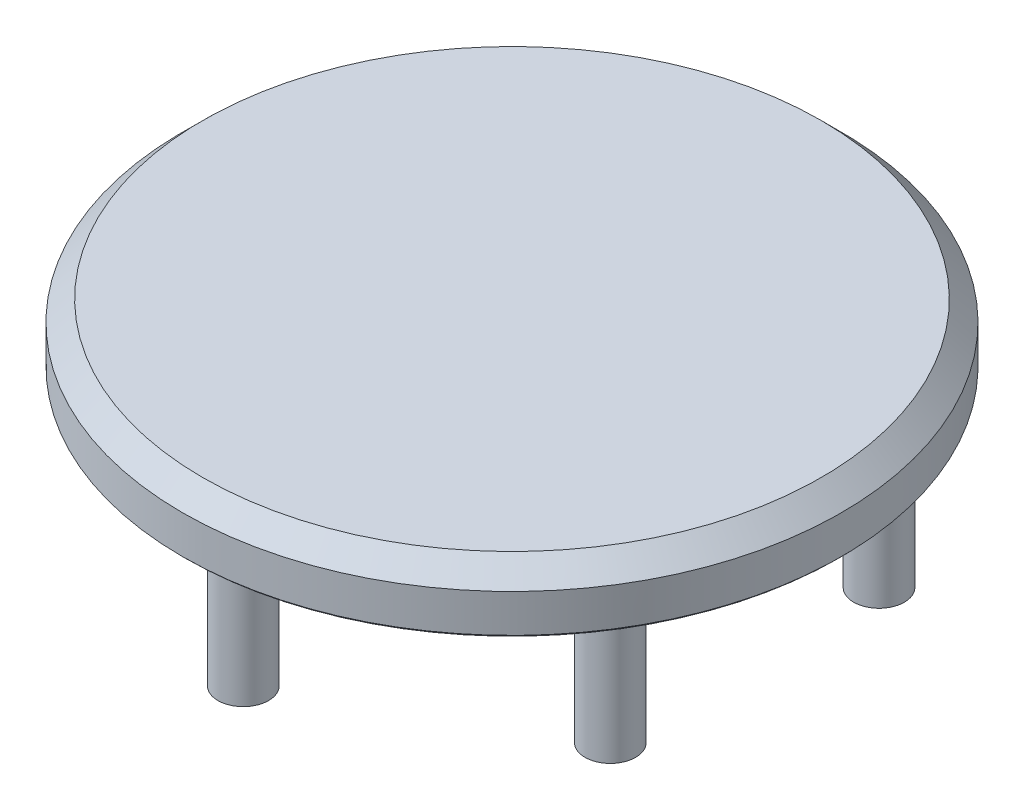
ISO-10303-21;
HEADER;
FILE_DESCRIPTION(('STEP AP214'),'2;1');
FILE_NAME('part.step','',(''),(''),'','','');
FILE_SCHEMA(('AUTOMOTIVE_DESIGN { 1 0 10303 214 1 1 1 1 }'));
ENDSEC;
DATA;
#1=APPLICATION_CONTEXT('core data for automotive mechanical design processes');
#2=APPLICATION_PROTOCOL_DEFINITION('international standard','automotive_design',2000,#1);
#3=PRODUCT_CONTEXT('',#1,'mechanical');
#4=PRODUCT('Part','Part','',(#3));
#5=PRODUCT_RELATED_PRODUCT_CATEGORY('part','',(#4));
#6=PRODUCT_DEFINITION_FORMATION('','',#4);
#7=PRODUCT_DEFINITION_CONTEXT('part definition',#1,'design');
#8=PRODUCT_DEFINITION('design','',#6,#7);
#9=PRODUCT_DEFINITION_SHAPE('','',#8);
#10=(LENGTH_UNIT() NAMED_UNIT(*) SI_UNIT(.MILLI.,.METRE.));
#11=(NAMED_UNIT(*) PLANE_ANGLE_UNIT() SI_UNIT($,.RADIAN.));
#12=(NAMED_UNIT(*) SI_UNIT($,.STERADIAN.) SOLID_ANGLE_UNIT());
#13=UNCERTAINTY_MEASURE_WITH_UNIT(LENGTH_MEASURE(1.E-05),#10,'distance_accuracy_value','');
#14=(GEOMETRIC_REPRESENTATION_CONTEXT(3) GLOBAL_UNCERTAINTY_ASSIGNED_CONTEXT((#13)) GLOBAL_UNIT_ASSIGNED_CONTEXT((#10,
#11,#12)) REPRESENTATION_CONTEXT('',''));
#15=CARTESIAN_POINT('',(0.,0.,0.));
#16=DIRECTION('',(0.,0.,1.));
#17=DIRECTION('',(1.,0.,0.));
#18=AXIS2_PLACEMENT_3D('',#15,#16,#17);
#19=CARTESIAN_POINT('',(0.,25.,0.));
#20=DIRECTION('',(0.,-1.,0.));
#21=DIRECTION('',(0.,0.,-1.));
#22=AXIS2_PLACEMENT_3D('',#19,#20,#21);
#23=PLANE('',#22);
#24=CARTESIAN_POINT('',(0.,25.,0.));
#25=DIRECTION('',(0.,-1.,0.));
#26=DIRECTION('',(0.,0.,-1.));
#27=AXIS2_PLACEMENT_3D('',#24,#25,#26);
#28=CIRCLE('',#27,32.25);
#29=CARTESIAN_POINT('',(0.,25.,-32.25));
#30=VERTEX_POINT('',#29);
#31=EDGE_CURVE('E10',#30,#30,#28,.T.);
#32=ORIENTED_EDGE('',*,*,#31,.T.);
#33=EDGE_LOOP('',(#32));
#34=FACE_BOUND('',#33,.T.);
#35=CARTESIAN_POINT('',(0.,25.,26.5));
#36=DIRECTION('',(0.,-1.,0.));
#37=DIRECTION('',(0.,0.,-1.));
#38=AXIS2_PLACEMENT_3D('',#35,#36,#37);
#39=CIRCLE('',#38,4.50000000000001);
#40=CARTESIAN_POINT('',(0.,25.,22.));
#41=VERTEX_POINT('',#40);
#42=EDGE_CURVE('E62',#41,#41,#39,.F.);
#43=ORIENTED_EDGE('',*,*,#42,.T.);
#44=EDGE_LOOP('',(#43));
#45=FACE_BOUND('',#44,.T.);
#46=CARTESIAN_POINT('',(-22.9496732002875,25.,13.2500000000003));
#47=DIRECTION('',(0.,-1.,0.));
#48=DIRECTION('',(0.,0.,-1.));
#49=AXIS2_PLACEMENT_3D('',#46,#47,#48);
#50=CIRCLE('',#49,4.49999999999999);
#51=CARTESIAN_POINT('',(-22.9496732002875,25.,8.75000000000028));
#52=VERTEX_POINT('',#51);
#53=EDGE_CURVE('E65',#52,#52,#50,.F.);
#54=ORIENTED_EDGE('',*,*,#53,.T.);
#55=EDGE_LOOP('',(#54));
#56=FACE_BOUND('',#55,.T.);
#57=CARTESIAN_POINT('',(-22.9496732002877,25.,-13.2499999999998));
#58=DIRECTION('',(0.,-1.,0.));
#59=DIRECTION('',(0.,0.,-1.));
#60=AXIS2_PLACEMENT_3D('',#57,#58,#59);
#61=CIRCLE('',#60,4.5);
#62=CARTESIAN_POINT('',(-22.9496732002877,25.,-17.7499999999998));
#63=VERTEX_POINT('',#62);
#64=EDGE_CURVE('E68',#63,#63,#61,.F.);
#65=ORIENTED_EDGE('',*,*,#64,.T.);
#66=EDGE_LOOP('',(#65));
#67=FACE_BOUND('',#66,.T.);
#68=CARTESIAN_POINT('',(0.,25.,-26.5));
#69=DIRECTION('',(0.,-1.,0.));
#70=DIRECTION('',(0.,0.,-1.));
#71=AXIS2_PLACEMENT_3D('',#68,#69,#70);
#72=CIRCLE('',#71,4.50000000000001);
#73=CARTESIAN_POINT('',(0.,25.,-31.));
#74=VERTEX_POINT('',#73);
#75=EDGE_CURVE('E71',#74,#74,#72,.F.);
#76=ORIENTED_EDGE('',*,*,#75,.T.);
#77=EDGE_LOOP('',(#76));
#78=FACE_BOUND('',#77,.T.);
#79=CARTESIAN_POINT('',(22.9496732002876,25.,-13.2500000000001));
#80=DIRECTION('',(0.,-1.,0.));
#81=DIRECTION('',(0.,0.,-1.));
#82=AXIS2_PLACEMENT_3D('',#79,#80,#81);
#83=CIRCLE('',#82,4.49999999999999);
#84=CARTESIAN_POINT('',(22.9496732002876,25.,-17.7500000000001));
#85=VERTEX_POINT('',#84);
#86=EDGE_CURVE('E74',#85,#85,#83,.F.);
#87=ORIENTED_EDGE('',*,*,#86,.T.);
#88=EDGE_LOOP('',(#87));
#89=FACE_BOUND('',#88,.T.);
#90=CARTESIAN_POINT('',(22.9496732002877,25.,13.2499999999999));
#91=DIRECTION('',(0.,-1.,0.));
#92=DIRECTION('',(0.,0.,-1.));
#93=AXIS2_PLACEMENT_3D('',#90,#91,#92);
#94=CIRCLE('',#93,4.49999999999997);
#95=CARTESIAN_POINT('',(22.9496732002877,25.,8.74999999999998));
#96=VERTEX_POINT('',#95);
#97=EDGE_CURVE('E77',#96,#96,#94,.F.);
#98=ORIENTED_EDGE('',*,*,#97,.T.);
#99=EDGE_LOOP('',(#98));
#100=FACE_BOUND('',#99,.T.);
#101=ADVANCED_FACE('F33',(#34,#45,#56,#67,#78,#89,#100),#23,.T.);
#102=CARTESIAN_POINT('',(0.,0.,0.));
#103=DIRECTION('',(0.,1.,0.));
#104=DIRECTION('',(0.,0.,1.));
#105=AXIS2_PLACEMENT_3D('',#102,#103,#104);
#106=CYLINDRICAL_SURFACE('',#105,32.5);
#107=CARTESIAN_POINT('',(0.,25.25,0.));
#108=DIRECTION('',(0.,-1.,0.));
#109=DIRECTION('',(0.,0.,-1.));
#110=AXIS2_PLACEMENT_3D('',#107,#108,#109);
#111=CIRCLE('',#110,32.5);
#112=CARTESIAN_POINT('',(0.,25.25,-32.5));
#113=VERTEX_POINT('',#112);
#114=EDGE_CURVE('E40',#113,#113,#111,.F.);
#115=ORIENTED_EDGE('',*,*,#114,.T.);
#116=EDGE_LOOP('',(#115));
#117=FACE_BOUND('',#116,.T.);
#118=CARTESIAN_POINT('',(0.,29.,0.));
#119=DIRECTION('',(0.,1.,0.));
#120=DIRECTION('',(0.,0.,1.));
#121=AXIS2_PLACEMENT_3D('',#118,#119,#120);
#122=CIRCLE('',#121,32.5);
#123=CARTESIAN_POINT('',(0.,29.,32.5));
#124=VERTEX_POINT('',#123);
#125=EDGE_CURVE('E83',#124,#124,#122,.F.);
#126=ORIENTED_EDGE('',*,*,#125,.T.);
#127=EDGE_LOOP('',(#126));
#128=FACE_BOUND('',#127,.T.);
#129=ADVANCED_FACE('F125',(#117,#128),#106,.T.);
#130=CARTESIAN_POINT('',(0.,31.,32.5));
#131=DIRECTION('',(0.,1.,0.));
#132=DIRECTION('',(0.,0.,1.));
#133=AXIS2_PLACEMENT_3D('',#130,#131,#132);
#134=PLANE('',#133);
#135=CARTESIAN_POINT('',(0.,31.,0.));
#136=DIRECTION('',(0.,1.,0.));
#137=DIRECTION('',(0.,0.,1.));
#138=AXIS2_PLACEMENT_3D('',#135,#136,#137);
#139=CIRCLE('',#138,30.5);
#140=CARTESIAN_POINT('',(0.,31.,30.5));
#141=VERTEX_POINT('',#140);
#142=EDGE_CURVE('E86',#141,#141,#139,.T.);
#143=ORIENTED_EDGE('',*,*,#142,.T.);
#144=EDGE_LOOP('',(#143));
#145=FACE_BOUND('',#144,.T.);
#146=ADVANCED_FACE('F130',(#145),#134,.T.);
#147=CARTESIAN_POINT('',(0.,31.,0.));
#148=DIRECTION('',(0.,-1.,0.));
#149=DIRECTION('',(0.,0.,-1.));
#150=AXIS2_PLACEMENT_3D('',#147,#148,#149);
#151=CONICAL_SURFACE('',#150,30.5,0.785398163397445);
#152=ORIENTED_EDGE('',*,*,#125,.F.);
#153=EDGE_LOOP('',(#152));
#154=FACE_BOUND('',#153,.T.);
#155=ORIENTED_EDGE('',*,*,#142,.F.);
#156=EDGE_LOOP('',(#155));
#157=FACE_BOUND('',#156,.T.);
#158=ADVANCED_FACE('F135',(#154,#157),#151,.T.);
#159=CARTESIAN_POINT('',(0.,4.12893218813453,26.5));
#160=DIRECTION('',(0.,1.,0.));
#161=DIRECTION('',(0.,0.,1.));
#162=AXIS2_PLACEMENT_3D('',#159,#160,#161);
#163=CYLINDRICAL_SURFACE('',#162,2.5);
#164=CARTESIAN_POINT('',(0.,23.,26.5));
#165=DIRECTION('',(0.,-1.,0.));
#166=DIRECTION('',(0.,0.,-1.));
#167=AXIS2_PLACEMENT_3D('',#164,#165,#166);
#168=CIRCLE('',#167,2.5);
#169=CARTESIAN_POINT('',(0.,23.,24.));
#170=VERTEX_POINT('',#169);
#171=EDGE_CURVE('E80',#170,#170,#168,.T.);
#172=ORIENTED_EDGE('',*,*,#171,.T.);
#173=EDGE_LOOP('',(#172));
#174=FACE_BOUND('',#173,.T.);
#175=CARTESIAN_POINT('',(0.,11.2,26.5));
#176=DIRECTION('',(0.,1.,0.));
#177=DIRECTION('',(0.,0.,1.));
#178=AXIS2_PLACEMENT_3D('',#175,#176,#177);
#179=CIRCLE('',#178,2.5);
#180=CARTESIAN_POINT('',(0.,11.2,29.));
#181=VERTEX_POINT('',#180);
#182=EDGE_CURVE('E89',#181,#181,#179,.T.);
#183=ORIENTED_EDGE('',*,*,#182,.T.);
#184=EDGE_LOOP('',(#183));
#185=FACE_BOUND('',#184,.T.);
#186=ADVANCED_FACE('F137',(#174,#185),#163,.T.);
#187=CARTESIAN_POINT('',(-32.,11.2,0.));
#188=DIRECTION('',(0.,1.,0.));
#189=DIRECTION('',(0.,0.,1.));
#190=AXIS2_PLACEMENT_3D('',#187,#188,#189);
#191=PLANE('',#190);
#192=ORIENTED_EDGE('',*,*,#182,.F.);
#193=EDGE_LOOP('',(#192));
#194=FACE_BOUND('',#193,.T.);
#195=ADVANCED_FACE('F169',(#194),#191,.F.);
#196=CARTESIAN_POINT('',(22.9496732002877,4.12893218813453,13.2499999999999));
#197=DIRECTION('',(0.,1.,0.));
#198=DIRECTION('',(0.86602540378444,0.,0.499999999999998));
#199=AXIS2_PLACEMENT_3D('',#196,#197,#198);
#200=CYLINDRICAL_SURFACE('',#199,2.5);
#201=CARTESIAN_POINT('',(22.9496732002877,23.,13.2499999999999));
#202=DIRECTION('',(0.,-1.,0.));
#203=DIRECTION('',(0.,0.,-1.));
#204=AXIS2_PLACEMENT_3D('',#201,#202,#203);
#205=CIRCLE('',#204,2.5);
#206=CARTESIAN_POINT('',(22.9496732002877,23.,10.7499999999999));
#207=VERTEX_POINT('',#206);
#208=EDGE_CURVE('E44',#207,#207,#205,.T.);
#209=ORIENTED_EDGE('',*,*,#208,.T.);
#210=EDGE_LOOP('',(#209));
#211=FACE_BOUND('',#210,.T.);
#212=CARTESIAN_POINT('',(22.9496732002877,11.2,13.2499999999999));
#213=DIRECTION('',(0.,1.,0.));
#214=DIRECTION('',(0.86602540378444,0.,0.499999999999998));
#215=AXIS2_PLACEMENT_3D('',#212,#213,#214);
#216=CIRCLE('',#215,2.5);
#217=CARTESIAN_POINT('',(25.1147367097488,11.2,14.4999999999999));
#218=VERTEX_POINT('',#217);
#219=EDGE_CURVE('E92',#218,#218,#216,.T.);
#220=ORIENTED_EDGE('',*,*,#219,.T.);
#221=EDGE_LOOP('',(#220));
#222=FACE_BOUND('',#221,.T.);
#223=ADVANCED_FACE('F165',(#211,#222),#200,.T.);
#224=CARTESIAN_POINT('',(-15.9999999999999,11.2,27.7128129211021));
#225=DIRECTION('',(0.,1.,0.));
#226=DIRECTION('',(0.86602540378444,0.,0.499999999999998));
#227=AXIS2_PLACEMENT_3D('',#224,#225,#226);
#228=PLANE('',#227);
#229=ORIENTED_EDGE('',*,*,#219,.F.);
#230=EDGE_LOOP('',(#229));
#231=FACE_BOUND('',#230,.T.);
#232=ADVANCED_FACE('F168',(#231),#228,.F.);
#233=CARTESIAN_POINT('',(22.9496732002876,4.12893218813453,-13.2500000000001));
#234=DIRECTION('',(0.,1.,0.));
#235=DIRECTION('',(0.866025403784436,0.,-0.500000000000004));
#236=AXIS2_PLACEMENT_3D('',#233,#234,#235);
#237=CYLINDRICAL_SURFACE('',#236,2.5);
#238=CARTESIAN_POINT('',(22.9496732002876,23.,-13.2500000000001));
#239=DIRECTION('',(0.,-1.,0.));
#240=DIRECTION('',(0.,0.,-1.));
#241=AXIS2_PLACEMENT_3D('',#238,#239,#240);
#242=CIRCLE('',#241,2.5);
#243=CARTESIAN_POINT('',(22.9496732002876,23.,-15.7500000000001));
#244=VERTEX_POINT('',#243);
#245=EDGE_CURVE('E48',#244,#244,#242,.T.);
#246=ORIENTED_EDGE('',*,*,#245,.T.);
#247=EDGE_LOOP('',(#246));
#248=FACE_BOUND('',#247,.T.);
#249=CARTESIAN_POINT('',(22.9496732002876,11.2,-13.2500000000001));
#250=DIRECTION('',(0.,1.,0.));
#251=DIRECTION('',(0.866025403784436,0.,-0.500000000000004));
#252=AXIS2_PLACEMENT_3D('',#249,#250,#251);
#253=CIRCLE('',#252,2.5);
#254=CARTESIAN_POINT('',(25.1147367097487,11.2,-14.5000000000001));
#255=VERTEX_POINT('',#254);
#256=EDGE_CURVE('E95',#255,#255,#253,.T.);
#257=ORIENTED_EDGE('',*,*,#256,.T.);
#258=EDGE_LOOP('',(#257));
#259=FACE_BOUND('',#258,.T.);
#260=ADVANCED_FACE('F174',(#248,#259),#237,.T.);
#261=CARTESIAN_POINT('',(16.0000000000001,11.2,27.712812921102));
#262=DIRECTION('',(0.,1.,0.));
#263=DIRECTION('',(0.866025403784436,0.,-0.500000000000004));
#264=AXIS2_PLACEMENT_3D('',#261,#262,#263);
#265=PLANE('',#264);
#266=ORIENTED_EDGE('',*,*,#256,.F.);
#267=EDGE_LOOP('',(#266));
#268=FACE_BOUND('',#267,.T.);
#269=ADVANCED_FACE('F179',(#268),#265,.F.);
#270=CARTESIAN_POINT('',(0.,4.12893218813453,-26.5));
#271=DIRECTION('',(0.,1.,0.));
#272=DIRECTION('',(0.,0.,-1.));
#273=AXIS2_PLACEMENT_3D('',#270,#271,#272);
#274=CYLINDRICAL_SURFACE('',#273,2.5);
#275=CARTESIAN_POINT('',(0.,23.,-26.5));
#276=DIRECTION('',(0.,-1.,0.));
#277=DIRECTION('',(0.,0.,-1.));
#278=AXIS2_PLACEMENT_3D('',#275,#276,#277);
#279=CIRCLE('',#278,2.5);
#280=CARTESIAN_POINT('',(0.,23.,-29.));
#281=VERTEX_POINT('',#280);
#282=EDGE_CURVE('E53',#281,#281,#279,.T.);
#283=ORIENTED_EDGE('',*,*,#282,.T.);
#284=EDGE_LOOP('',(#283));
#285=FACE_BOUND('',#284,.T.);
#286=CARTESIAN_POINT('',(0.,11.2,-26.5));
#287=DIRECTION('',(0.,1.,0.));
#288=DIRECTION('',(0.,0.,-1.));
#289=AXIS2_PLACEMENT_3D('',#286,#287,#288);
#290=CIRCLE('',#289,2.5);
#291=CARTESIAN_POINT('',(0.,11.2,-29.));
#292=VERTEX_POINT('',#291);
#293=EDGE_CURVE('E98',#292,#292,#290,.T.);
#294=ORIENTED_EDGE('',*,*,#293,.T.);
#295=EDGE_LOOP('',(#294));
#296=FACE_BOUND('',#295,.T.);
#297=ADVANCED_FACE('F227',(#285,#296),#274,.T.);
#298=CARTESIAN_POINT('',(32.,11.2,0.));
#299=DIRECTION('',(0.,1.,0.));
#300=DIRECTION('',(0.,0.,-1.));
#301=AXIS2_PLACEMENT_3D('',#298,#299,#300);
#302=PLANE('',#301);
#303=ORIENTED_EDGE('',*,*,#293,.F.);
#304=EDGE_LOOP('',(#303));
#305=FACE_BOUND('',#304,.T.);
#306=ADVANCED_FACE('F232',(#305),#302,.F.);
#307=CARTESIAN_POINT('',(-22.9496732002877,4.12893218813453,-13.2499999999998));
#308=DIRECTION('',(0.,1.,0.));
#309=DIRECTION('',(-0.866025403784443,0.,-0.499999999999992));
#310=AXIS2_PLACEMENT_3D('',#307,#308,#309);
#311=CYLINDRICAL_SURFACE('',#310,2.5);
#312=CARTESIAN_POINT('',(-22.9496732002877,23.,-13.2499999999998));
#313=DIRECTION('',(0.,-1.,0.));
#314=DIRECTION('',(0.,0.,-1.));
#315=AXIS2_PLACEMENT_3D('',#312,#313,#314);
#316=CIRCLE('',#315,2.5);
#317=CARTESIAN_POINT('',(-22.9496732002877,23.,-15.7499999999998));
#318=VERTEX_POINT('',#317);
#319=EDGE_CURVE('E56',#318,#318,#316,.T.);
#320=ORIENTED_EDGE('',*,*,#319,.T.);
#321=EDGE_LOOP('',(#320));
#322=FACE_BOUND('',#321,.T.);
#323=CARTESIAN_POINT('',(-22.9496732002877,11.2,-13.2499999999998));
#324=DIRECTION('',(0.,1.,0.));
#325=DIRECTION('',(-0.866025403784443,0.,-0.499999999999992));
#326=AXIS2_PLACEMENT_3D('',#323,#324,#325);
#327=CIRCLE('',#326,2.5);
#328=CARTESIAN_POINT('',(-25.1147367097489,11.2,-14.4999999999998));
#329=VERTEX_POINT('',#328);
#330=EDGE_CURVE('E101',#329,#329,#327,.T.);
#331=ORIENTED_EDGE('',*,*,#330,.T.);
#332=EDGE_LOOP('',(#331));
#333=FACE_BOUND('',#332,.T.);
#334=ADVANCED_FACE('F240',(#322,#333),#311,.T.);
#335=CARTESIAN_POINT('',(15.9999999999997,11.2,-27.7128129211022));
#336=DIRECTION('',(0.,1.,0.));
#337=DIRECTION('',(-0.866025403784443,0.,-0.499999999999992));
#338=AXIS2_PLACEMENT_3D('',#335,#336,#337);
#339=PLANE('',#338);
#340=ORIENTED_EDGE('',*,*,#330,.F.);
#341=EDGE_LOOP('',(#340));
#342=FACE_BOUND('',#341,.T.);
#343=ADVANCED_FACE('F121',(#342),#339,.F.);
#344=CARTESIAN_POINT('',(-22.9496732002875,4.12893218813453,13.2500000000003));
#345=DIRECTION('',(0.,1.,0.));
#346=DIRECTION('',(-0.866025403784433,0.,0.50000000000001));
#347=AXIS2_PLACEMENT_3D('',#344,#345,#346);
#348=CYLINDRICAL_SURFACE('',#347,2.5);
#349=CARTESIAN_POINT('',(-22.9496732002875,23.,13.2500000000003));
#350=DIRECTION('',(0.,-1.,0.));
#351=DIRECTION('',(0.,0.,-1.));
#352=AXIS2_PLACEMENT_3D('',#349,#350,#351);
#353=CIRCLE('',#352,2.5);
#354=CARTESIAN_POINT('',(-22.9496732002875,23.,10.7500000000003));
#355=VERTEX_POINT('',#354);
#356=EDGE_CURVE('E59',#355,#355,#353,.T.);
#357=ORIENTED_EDGE('',*,*,#356,.T.);
#358=EDGE_LOOP('',(#357));
#359=FACE_BOUND('',#358,.T.);
#360=CARTESIAN_POINT('',(-22.9496732002875,11.2,13.2500000000003));
#361=DIRECTION('',(0.,1.,0.));
#362=DIRECTION('',(-0.866025403784433,0.,0.50000000000001));
#363=AXIS2_PLACEMENT_3D('',#360,#361,#362);
#364=CIRCLE('',#363,2.5);
#365=CARTESIAN_POINT('',(-25.1147367097485,11.2,14.5000000000003));
#366=VERTEX_POINT('',#365);
#367=EDGE_CURVE('E104',#366,#366,#364,.T.);
#368=ORIENTED_EDGE('',*,*,#367,.T.);
#369=EDGE_LOOP('',(#368));
#370=FACE_BOUND('',#369,.T.);
#371=ADVANCED_FACE('F108',(#359,#370),#348,.T.);
#372=CARTESIAN_POINT('',(-16.0000000000003,11.2,-27.7128129211019));
#373=DIRECTION('',(0.,1.,0.));
#374=DIRECTION('',(-0.866025403784433,0.,0.50000000000001));
#375=AXIS2_PLACEMENT_3D('',#372,#373,#374);
#376=PLANE('',#375);
#377=ORIENTED_EDGE('',*,*,#367,.F.);
#378=EDGE_LOOP('',(#377));
#379=FACE_BOUND('',#378,.T.);
#380=ADVANCED_FACE('F110',(#379),#376,.F.);
#381=CARTESIAN_POINT('',(0.,23.,26.5));
#382=DIRECTION('',(0.,1.,0.));
#383=DIRECTION('',(0.,0.,1.));
#384=AXIS2_PLACEMENT_3D('',#381,#382,#383);
#385=CONICAL_SURFACE('',#384,2.5,0.785398163397445);
#386=ORIENTED_EDGE('',*,*,#42,.F.);
#387=EDGE_LOOP('',(#386));
#388=FACE_BOUND('',#387,.T.);
#389=ORIENTED_EDGE('',*,*,#171,.F.);
#390=EDGE_LOOP('',(#389));
#391=FACE_BOUND('',#390,.T.);
#392=ADVANCED_FACE('F112',(#388,#391),#385,.T.);
#393=CARTESIAN_POINT('',(-22.9496732002875,23.,13.2500000000003));
#394=DIRECTION('',(0.,1.,0.));
#395=DIRECTION('',(0.,0.,1.));
#396=AXIS2_PLACEMENT_3D('',#393,#394,#395);
#397=CONICAL_SURFACE('',#396,2.5,0.78539816339744);
#398=ORIENTED_EDGE('',*,*,#53,.F.);
#399=EDGE_LOOP('',(#398));
#400=FACE_BOUND('',#399,.T.);
#401=ORIENTED_EDGE('',*,*,#356,.F.);
#402=EDGE_LOOP('',(#401));
#403=FACE_BOUND('',#402,.T.);
#404=ADVANCED_FACE('F118',(#400,#403),#397,.T.);
#405=CARTESIAN_POINT('',(-22.9496732002877,23.,-13.2499999999998));
#406=DIRECTION('',(0.,1.,0.));
#407=DIRECTION('',(0.,0.,1.));
#408=AXIS2_PLACEMENT_3D('',#405,#406,#407);
#409=CONICAL_SURFACE('',#408,2.5,0.785398163397444);
#410=ORIENTED_EDGE('',*,*,#64,.F.);
#411=EDGE_LOOP('',(#410));
#412=FACE_BOUND('',#411,.T.);
#413=ORIENTED_EDGE('',*,*,#319,.F.);
#414=EDGE_LOOP('',(#413));
#415=FACE_BOUND('',#414,.T.);
#416=ADVANCED_FACE('F142',(#412,#415),#409,.T.);
#417=CARTESIAN_POINT('',(0.,23.,-26.5));
#418=DIRECTION('',(0.,1.,0.));
#419=DIRECTION('',(0.,0.,1.));
#420=AXIS2_PLACEMENT_3D('',#417,#418,#419);
#421=CONICAL_SURFACE('',#420,2.5,0.785398163397445);
#422=ORIENTED_EDGE('',*,*,#75,.F.);
#423=EDGE_LOOP('',(#422));
#424=FACE_BOUND('',#423,.T.);
#425=ORIENTED_EDGE('',*,*,#282,.F.);
#426=EDGE_LOOP('',(#425));
#427=FACE_BOUND('',#426,.T.);
#428=ADVANCED_FACE('F146',(#424,#427),#421,.T.);
#429=CARTESIAN_POINT('',(22.9496732002876,23.,-13.2500000000001));
#430=DIRECTION('',(0.,1.,0.));
#431=DIRECTION('',(0.,0.,1.));
#432=AXIS2_PLACEMENT_3D('',#429,#430,#431);
#433=CONICAL_SURFACE('',#432,2.5,0.785398163397443);
#434=ORIENTED_EDGE('',*,*,#86,.F.);
#435=EDGE_LOOP('',(#434));
#436=FACE_BOUND('',#435,.T.);
#437=ORIENTED_EDGE('',*,*,#245,.F.);
#438=EDGE_LOOP('',(#437));
#439=FACE_BOUND('',#438,.T.);
#440=ADVANCED_FACE('F150',(#436,#439),#433,.T.);
#441=CARTESIAN_POINT('',(22.9496732002877,23.,13.2499999999999));
#442=DIRECTION('',(0.,1.,0.));
#443=DIRECTION('',(0.,0.,1.));
#444=AXIS2_PLACEMENT_3D('',#441,#442,#443);
#445=CONICAL_SURFACE('',#444,2.5,0.785398163397442);
#446=ORIENTED_EDGE('',*,*,#97,.F.);
#447=EDGE_LOOP('',(#446));
#448=FACE_BOUND('',#447,.T.);
#449=ORIENTED_EDGE('',*,*,#208,.F.);
#450=EDGE_LOOP('',(#449));
#451=FACE_BOUND('',#450,.T.);
#452=ADVANCED_FACE('F153',(#448,#451),#445,.T.);
#453=CARTESIAN_POINT('',(0.,25.25,0.));
#454=DIRECTION('',(0.,1.,0.));
#455=DIRECTION('',(0.,0.,1.));
#456=AXIS2_PLACEMENT_3D('',#453,#454,#455);
#457=CONICAL_SURFACE('',#456,32.5,0.785398163397435);
#458=ORIENTED_EDGE('',*,*,#31,.F.);
#459=EDGE_LOOP('',(#458));
#460=FACE_BOUND('',#459,.T.);
#461=ORIENTED_EDGE('',*,*,#114,.F.);
#462=EDGE_LOOP('',(#461));
#463=FACE_BOUND('',#462,.T.);
#464=ADVANCED_FACE('F35',(#460,#463),#457,.T.);
#465=CLOSED_SHELL('',(#101,#129,#146,#158,#186,#195,#223,#232,#260,#269,#297,#306,#334,#343,
#371,#380,#392,#404,#416,#428,#440,#452,#464));
#466=MANIFOLD_SOLID_BREP('B2',#465);
#467=ADVANCED_BREP_SHAPE_REPRESENTATION('',(#18,#466),#14);
#468=SHAPE_DEFINITION_REPRESENTATION(#9,#467);
ENDSEC;
END-ISO-10303-21;
